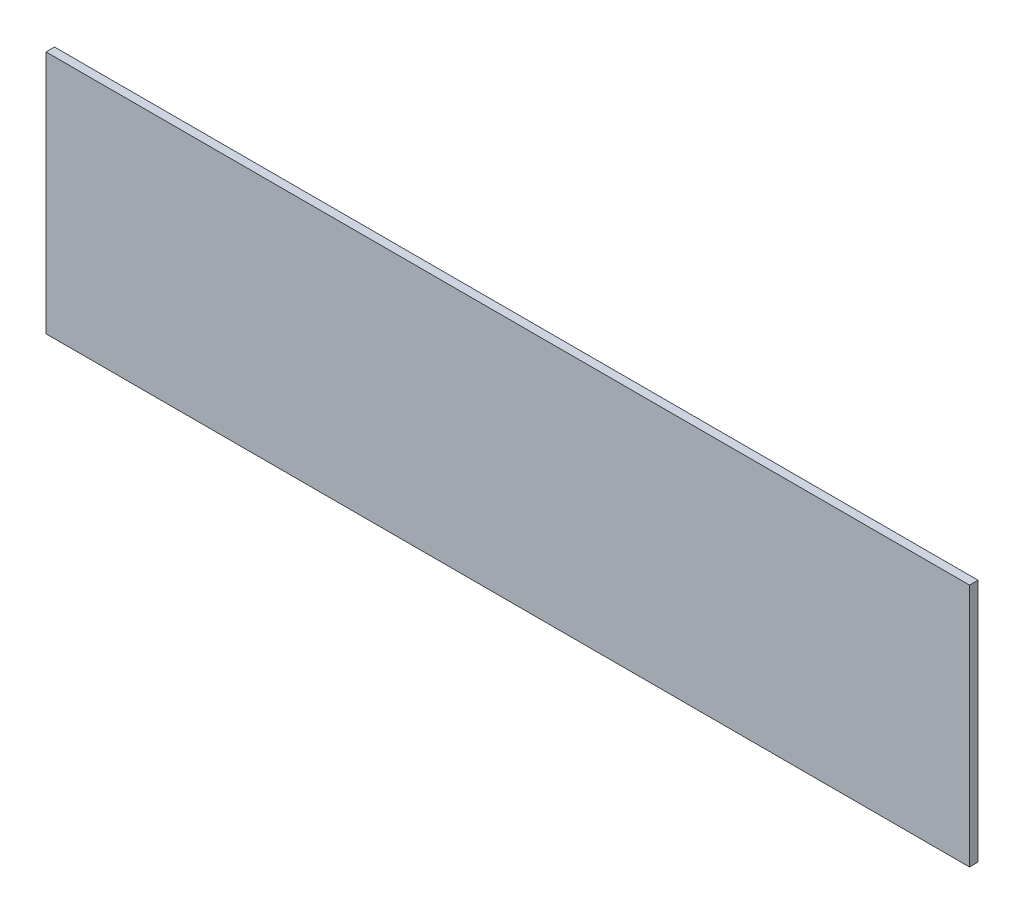
ISO-10303-21;
HEADER;
FILE_DESCRIPTION(('STEP AP214'),'2;1');
FILE_NAME('part.step','',(''),(''),'','','');
FILE_SCHEMA(('AUTOMOTIVE_DESIGN { 1 0 10303 214 1 1 1 1 }'));
ENDSEC;
DATA;
#1=APPLICATION_CONTEXT('core data for automotive mechanical design processes');
#2=APPLICATION_PROTOCOL_DEFINITION('international standard','automotive_design',2000,#1);
#3=PRODUCT_CONTEXT('',#1,'mechanical');
#4=PRODUCT('Part','Part','',(#3));
#5=PRODUCT_RELATED_PRODUCT_CATEGORY('part','',(#4));
#6=PRODUCT_DEFINITION_FORMATION('','',#4);
#7=PRODUCT_DEFINITION_CONTEXT('part definition',#1,'design');
#8=PRODUCT_DEFINITION('design','',#6,#7);
#9=PRODUCT_DEFINITION_SHAPE('','',#8);
#10=(LENGTH_UNIT() NAMED_UNIT(*) SI_UNIT(.MILLI.,.METRE.));
#11=(NAMED_UNIT(*) PLANE_ANGLE_UNIT() SI_UNIT($,.RADIAN.));
#12=(NAMED_UNIT(*) SI_UNIT($,.STERADIAN.) SOLID_ANGLE_UNIT());
#13=UNCERTAINTY_MEASURE_WITH_UNIT(LENGTH_MEASURE(1.E-05),#10,'distance_accuracy_value','');
#14=(GEOMETRIC_REPRESENTATION_CONTEXT(3) GLOBAL_UNCERTAINTY_ASSIGNED_CONTEXT((#13)) GLOBAL_UNIT_ASSIGNED_CONTEXT((#10,
#11,#12)) REPRESENTATION_CONTEXT('',''));
#15=CARTESIAN_POINT('',(0.,0.,0.));
#16=DIRECTION('',(0.,0.,1.));
#17=DIRECTION('',(1.,0.,0.));
#18=AXIS2_PLACEMENT_3D('',#15,#16,#17);
#19=CARTESIAN_POINT('',(217.5,57.5,4.));
#20=DIRECTION('',(-1.,0.,0.));
#21=DIRECTION('',(0.,0.,1.));
#22=AXIS2_PLACEMENT_3D('',#19,#20,#21);
#23=PLANE('',#22);
#24=DIRECTION('',(0.,1.,0.));
#25=VECTOR('',#24,1.);
#26=CARTESIAN_POINT('',(217.5,57.5,0.));
#27=LINE('',#26,#25);
#28=CARTESIAN_POINT('',(217.5,-57.5,0.));
#29=VERTEX_POINT('',#28);
#30=CARTESIAN_POINT('',(217.5,57.5,0.));
#31=VERTEX_POINT('',#30);
#32=EDGE_CURVE('E95',#29,#31,#27,.T.);
#33=ORIENTED_EDGE('',*,*,#32,.T.);
#34=DIRECTION('',(0.,0.,-1.));
#35=VECTOR('',#34,1.);
#36=CARTESIAN_POINT('',(217.5,57.5,4.));
#37=LINE('',#36,#35);
#38=CARTESIAN_POINT('',(217.5,57.5,4.));
#39=VERTEX_POINT('',#38);
#40=EDGE_CURVE('E11',#39,#31,#37,.T.);
#41=ORIENTED_EDGE('',*,*,#40,.F.);
#42=DIRECTION('',(0.,1.,0.));
#43=VECTOR('',#42,1.);
#44=CARTESIAN_POINT('',(217.5,57.5,4.));
#45=LINE('',#44,#43);
#46=CARTESIAN_POINT('',(217.5,-57.5,4.));
#47=VERTEX_POINT('',#46);
#48=EDGE_CURVE('E83',#47,#39,#45,.T.);
#49=ORIENTED_EDGE('',*,*,#48,.F.);
#50=DIRECTION('',(0.,0.,-1.));
#51=VECTOR('',#50,1.);
#52=CARTESIAN_POINT('',(217.5,-57.5,4.));
#53=LINE('',#52,#51);
#54=EDGE_CURVE('E91',#47,#29,#53,.T.);
#55=ORIENTED_EDGE('',*,*,#54,.T.);
#56=EDGE_LOOP('',(#33,#41,#49,#55));
#57=FACE_BOUND('',#56,.T.);
#58=ADVANCED_FACE('F32',(#57),#23,.F.);
#59=CARTESIAN_POINT('',(-217.5,57.5,4.));
#60=DIRECTION('',(0.,-1.,0.));
#61=DIRECTION('',(0.,0.,-1.));
#62=AXIS2_PLACEMENT_3D('',#59,#60,#61);
#63=PLANE('',#62);
#64=DIRECTION('',(-1.,0.,0.));
#65=VECTOR('',#64,1.);
#66=CARTESIAN_POINT('',(-217.5,57.5,0.));
#67=LINE('',#66,#65);
#68=CARTESIAN_POINT('',(-217.5,57.5,0.));
#69=VERTEX_POINT('',#68);
#70=EDGE_CURVE('E87',#31,#69,#67,.T.);
#71=ORIENTED_EDGE('',*,*,#70,.T.);
#72=DIRECTION('',(0.,0.,-1.));
#73=VECTOR('',#72,1.);
#74=CARTESIAN_POINT('',(-217.5,57.5,4.));
#75=LINE('',#74,#73);
#76=CARTESIAN_POINT('',(-217.5,57.5,4.));
#77=VERTEX_POINT('',#76);
#78=EDGE_CURVE('E40',#77,#69,#75,.T.);
#79=ORIENTED_EDGE('',*,*,#78,.F.);
#80=DIRECTION('',(-1.,0.,0.));
#81=VECTOR('',#80,1.);
#82=CARTESIAN_POINT('',(-217.5,57.5,4.));
#83=LINE('',#82,#81);
#84=EDGE_CURVE('E78',#39,#77,#83,.T.);
#85=ORIENTED_EDGE('',*,*,#84,.F.);
#86=ORIENTED_EDGE('',*,*,#40,.T.);
#87=EDGE_LOOP('',(#71,#79,#85,#86));
#88=FACE_BOUND('',#87,.T.);
#89=ADVANCED_FACE('F86',(#88),#63,.F.);
#90=CARTESIAN_POINT('',(-217.5,57.5,4.));
#91=DIRECTION('',(1.,0.,0.));
#92=DIRECTION('',(0.,0.,-1.));
#93=AXIS2_PLACEMENT_3D('',#90,#91,#92);
#94=PLANE('',#93);
#95=DIRECTION('',(0.,-1.,0.));
#96=VECTOR('',#95,1.);
#97=CARTESIAN_POINT('',(-217.5,57.5,0.));
#98=LINE('',#97,#96);
#99=CARTESIAN_POINT('',(-217.5,-57.5,0.));
#100=VERTEX_POINT('',#99);
#101=EDGE_CURVE('E65',#69,#100,#98,.T.);
#102=ORIENTED_EDGE('',*,*,#101,.T.);
#103=DIRECTION('',(0.,0.,-1.));
#104=VECTOR('',#103,1.);
#105=CARTESIAN_POINT('',(-217.5,-57.5,4.));
#106=LINE('',#105,#104);
#107=CARTESIAN_POINT('',(-217.5,-57.5,4.));
#108=VERTEX_POINT('',#107);
#109=EDGE_CURVE('E88',#108,#100,#106,.T.);
#110=ORIENTED_EDGE('',*,*,#109,.F.);
#111=DIRECTION('',(0.,-1.,0.));
#112=VECTOR('',#111,1.);
#113=CARTESIAN_POINT('',(-217.5,57.5,4.));
#114=LINE('',#113,#112);
#115=EDGE_CURVE('E81',#77,#108,#114,.T.);
#116=ORIENTED_EDGE('',*,*,#115,.F.);
#117=ORIENTED_EDGE('',*,*,#78,.T.);
#118=EDGE_LOOP('',(#102,#110,#116,#117));
#119=FACE_BOUND('',#118,.T.);
#120=ADVANCED_FACE('F89',(#119),#94,.F.);
#121=CARTESIAN_POINT('',(-217.5,-57.5,4.));
#122=DIRECTION('',(0.,1.,0.));
#123=DIRECTION('',(0.,0.,1.));
#124=AXIS2_PLACEMENT_3D('',#121,#122,#123);
#125=PLANE('',#124);
#126=DIRECTION('',(1.,0.,0.));
#127=VECTOR('',#126,1.);
#128=CARTESIAN_POINT('',(-217.5,-57.5,0.));
#129=LINE('',#128,#127);
#130=EDGE_CURVE('E71',#100,#29,#129,.T.);
#131=ORIENTED_EDGE('',*,*,#130,.T.);
#132=ORIENTED_EDGE('',*,*,#54,.F.);
#133=DIRECTION('',(1.,0.,0.));
#134=VECTOR('',#133,1.);
#135=CARTESIAN_POINT('',(-217.5,-57.5,4.));
#136=LINE('',#135,#134);
#137=EDGE_CURVE('E48',#108,#47,#136,.T.);
#138=ORIENTED_EDGE('',*,*,#137,.F.);
#139=ORIENTED_EDGE('',*,*,#109,.T.);
#140=EDGE_LOOP('',(#131,#132,#138,#139));
#141=FACE_BOUND('',#140,.T.);
#142=ADVANCED_FACE('F102',(#141),#125,.F.);
#143=CARTESIAN_POINT('',(0.,0.,4.));
#144=DIRECTION('',(0.,0.,1.));
#145=DIRECTION('',(1.,0.,0.));
#146=AXIS2_PLACEMENT_3D('',#143,#144,#145);
#147=PLANE('',#146);
#148=ORIENTED_EDGE('',*,*,#48,.T.);
#149=ORIENTED_EDGE('',*,*,#84,.T.);
#150=ORIENTED_EDGE('',*,*,#115,.T.);
#151=ORIENTED_EDGE('',*,*,#137,.T.);
#152=EDGE_LOOP('',(#148,#149,#150,#151));
#153=FACE_BOUND('',#152,.T.);
#154=ADVANCED_FACE('F79',(#153),#147,.T.);
#155=CARTESIAN_POINT('',(0.,0.,0.));
#156=DIRECTION('',(0.,0.,1.));
#157=DIRECTION('',(1.,0.,0.));
#158=AXIS2_PLACEMENT_3D('',#155,#156,#157);
#159=PLANE('',#158);
#160=ORIENTED_EDGE('',*,*,#32,.F.);
#161=ORIENTED_EDGE('',*,*,#130,.F.);
#162=ORIENTED_EDGE('',*,*,#101,.F.);
#163=ORIENTED_EDGE('',*,*,#70,.F.);
#164=EDGE_LOOP('',(#160,#161,#162,#163));
#165=FACE_BOUND('',#164,.T.);
#166=ADVANCED_FACE('F105',(#165),#159,.F.);
#167=CLOSED_SHELL('',(#58,#89,#120,#142,#154,#166));
#168=MANIFOLD_SOLID_BREP('B2',#167);
#169=ADVANCED_BREP_SHAPE_REPRESENTATION('',(#18,#168),#14);
#170=SHAPE_DEFINITION_REPRESENTATION(#9,#169);
ENDSEC;
END-ISO-10303-21;
